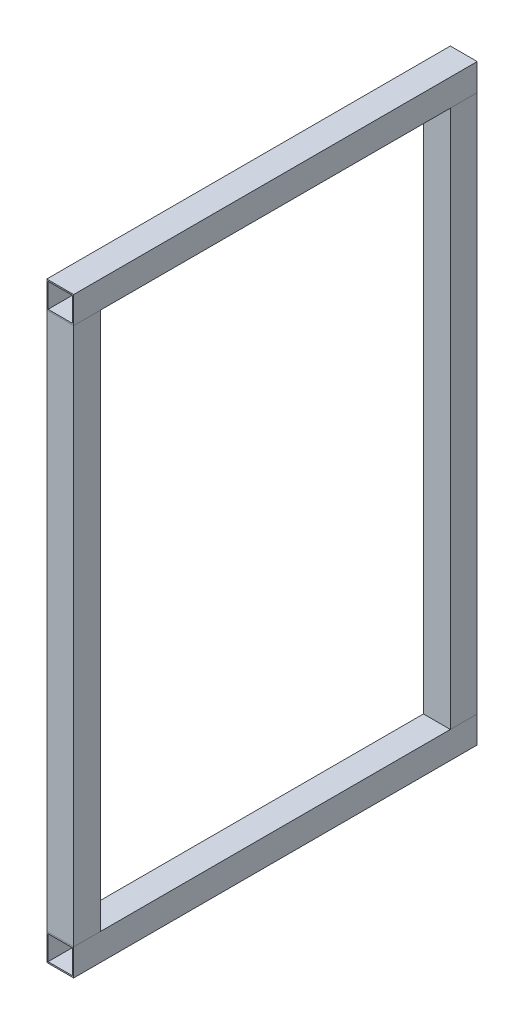
ISO-10303-21;
HEADER;
FILE_DESCRIPTION(('STEP AP214'),'2;1');
FILE_NAME('part.step','',(''),(''),'','','');
FILE_SCHEMA(('AUTOMOTIVE_DESIGN { 1 0 10303 214 1 1 1 1 }'));
ENDSEC;
DATA;
#1=APPLICATION_CONTEXT('core data for automotive mechanical design processes');
#2=APPLICATION_PROTOCOL_DEFINITION('international standard','automotive_design',2000,#1);
#3=PRODUCT_CONTEXT('',#1,'mechanical');
#4=PRODUCT('Part','Part','',(#3));
#5=PRODUCT_RELATED_PRODUCT_CATEGORY('part','',(#4));
#6=PRODUCT_DEFINITION_FORMATION('','',#4);
#7=PRODUCT_DEFINITION_CONTEXT('part definition',#1,'design');
#8=PRODUCT_DEFINITION('design','',#6,#7);
#9=PRODUCT_DEFINITION_SHAPE('','',#8);
#10=(LENGTH_UNIT() NAMED_UNIT(*) SI_UNIT(.MILLI.,.METRE.));
#11=(NAMED_UNIT(*) PLANE_ANGLE_UNIT() SI_UNIT($,.RADIAN.));
#12=(NAMED_UNIT(*) SI_UNIT($,.STERADIAN.) SOLID_ANGLE_UNIT());
#13=UNCERTAINTY_MEASURE_WITH_UNIT(LENGTH_MEASURE(1.E-05),#10,'distance_accuracy_value','');
#14=(GEOMETRIC_REPRESENTATION_CONTEXT(3) GLOBAL_UNCERTAINTY_ASSIGNED_CONTEXT((#13)) GLOBAL_UNIT_ASSIGNED_CONTEXT((#10,
#11,#12)) REPRESENTATION_CONTEXT('',''));
#15=CARTESIAN_POINT('',(0.,0.,0.));
#16=DIRECTION('',(0.,0.,1.));
#17=DIRECTION('',(1.,0.,0.));
#18=AXIS2_PLACEMENT_3D('',#15,#16,#17);
#19=CARTESIAN_POINT('',(133.460829178898,651.380801322445,468.106973865602));
#20=DIRECTION('',(0.,0.,-1.));
#21=DIRECTION('',(-1.,0.,0.));
#22=AXIS2_PLACEMENT_3D('',#19,#20,#21);
#23=PLANE('',#22);
#24=DIRECTION('',(0.,1.,0.));
#25=VECTOR('',#24,1.);
#26=CARTESIAN_POINT('',(143.460829178898,641.380801322445,468.106973865602));
#27=LINE('',#26,#25);
#28=CARTESIAN_POINT('',(143.460829178898,641.380801322445,468.106973865602));
#29=VERTEX_POINT('',#28);
#30=CARTESIAN_POINT('',(143.460829178898,661.380801322445,468.106973865602));
#31=VERTEX_POINT('',#30);
#32=EDGE_CURVE('P0_E117',#29,#31,#27,.T.);
#33=ORIENTED_EDGE('',*,*,#32,.T.);
#34=DIRECTION('',(-1.,0.,0.));
#35=VECTOR('',#34,1.);
#36=CARTESIAN_POINT('',(123.460829178898,661.380801322445,468.106973865602));
#37=LINE('',#36,#35);
#38=CARTESIAN_POINT('',(123.460829178898,661.380801322445,468.106973865602));
#39=VERTEX_POINT('',#38);
#40=EDGE_CURVE('P0_E120',#31,#39,#37,.T.);
#41=ORIENTED_EDGE('',*,*,#40,.T.);
#42=DIRECTION('',(0.,-1.,0.));
#43=VECTOR('',#42,1.);
#44=CARTESIAN_POINT('',(123.460829178898,641.380801322445,468.106973865602));
#45=LINE('',#44,#43);
#46=CARTESIAN_POINT('',(123.460829178898,641.380801322445,468.106973865602));
#47=VERTEX_POINT('',#46);
#48=EDGE_CURVE('P0_E123',#39,#47,#45,.T.);
#49=ORIENTED_EDGE('',*,*,#48,.T.);
#50=DIRECTION('',(1.,0.,0.));
#51=VECTOR('',#50,1.);
#52=CARTESIAN_POINT('',(123.460829178898,641.380801322445,468.106973865602));
#53=LINE('',#52,#51);
#54=EDGE_CURVE('P0_E125',#47,#29,#53,.T.);
#55=ORIENTED_EDGE('',*,*,#54,.T.);
#56=EDGE_LOOP('',(#33,#41,#49,#55));
#57=FACE_BOUND('',#56,.T.);
#58=DIRECTION('',(0.,-1.,0.));
#59=VECTOR('',#58,1.);
#60=CARTESIAN_POINT('',(124.460829178898,642.380801322445,468.106973865602));
#61=LINE('',#60,#59);
#62=CARTESIAN_POINT('',(124.460829178898,660.380801322445,468.106973865602));
#63=VERTEX_POINT('',#62);
#64=CARTESIAN_POINT('',(124.460829178898,642.380801322445,468.106973865602));
#65=VERTEX_POINT('',#64);
#66=EDGE_CURVE('P0_E81',#63,#65,#61,.T.);
#67=ORIENTED_EDGE('',*,*,#66,.F.);
#68=DIRECTION('',(-1.,0.,0.));
#69=VECTOR('',#68,1.);
#70=CARTESIAN_POINT('',(124.460829178898,660.380801322445,468.106973865602));
#71=LINE('',#70,#69);
#72=CARTESIAN_POINT('',(142.460829178898,660.380801322445,468.106973865602));
#73=VERTEX_POINT('',#72);
#74=EDGE_CURVE('P0_E103',#73,#63,#71,.T.);
#75=ORIENTED_EDGE('',*,*,#74,.F.);
#76=DIRECTION('',(0.,1.,0.));
#77=VECTOR('',#76,1.);
#78=CARTESIAN_POINT('',(142.460829178898,642.380801322445,468.106973865602));
#79=LINE('',#78,#77);
#80=CARTESIAN_POINT('',(142.460829178898,642.380801322445,468.106973865602));
#81=VERTEX_POINT('',#80);
#82=EDGE_CURVE('P0_E101',#81,#73,#79,.T.);
#83=ORIENTED_EDGE('',*,*,#82,.F.);
#84=DIRECTION('',(1.,0.,0.));
#85=VECTOR('',#84,1.);
#86=CARTESIAN_POINT('',(124.460829178898,642.380801322445,468.106973865602));
#87=LINE('',#86,#85);
#88=EDGE_CURVE('P0_E89',#65,#81,#87,.T.);
#89=ORIENTED_EDGE('',*,*,#88,.F.);
#90=EDGE_LOOP('',(#67,#75,#83,#89));
#91=FACE_BOUND('',#90,.T.);
#92=ADVANCED_FACE('P0_F16',(#57,#91),#23,.F.);
#93=CARTESIAN_POINT('',(133.460829178898,651.380801322445,168.106973865602));
#94=DIRECTION('',(0.,0.,-1.));
#95=DIRECTION('',(-1.,0.,0.));
#96=AXIS2_PLACEMENT_3D('',#93,#94,#95);
#97=PLANE('',#96);
#98=DIRECTION('',(0.,1.,0.));
#99=VECTOR('',#98,1.);
#100=CARTESIAN_POINT('',(143.460829178898,641.380801322445,168.106973865602));
#101=LINE('',#100,#99);
#102=CARTESIAN_POINT('',(143.460829178898,641.380801322445,168.106973865602));
#103=VERTEX_POINT('',#102);
#104=CARTESIAN_POINT('',(143.460829178898,661.380801322445,168.106973865602));
#105=VERTEX_POINT('',#104);
#106=EDGE_CURVE('P0_E97',#103,#105,#101,.T.);
#107=ORIENTED_EDGE('',*,*,#106,.F.);
#108=DIRECTION('',(1.,0.,0.));
#109=VECTOR('',#108,1.);
#110=CARTESIAN_POINT('',(123.460829178898,641.380801322445,168.106973865602));
#111=LINE('',#110,#109);
#112=CARTESIAN_POINT('',(123.460829178898,641.380801322445,168.106973865602));
#113=VERTEX_POINT('',#112);
#114=EDGE_CURVE('P0_E121',#113,#103,#111,.T.);
#115=ORIENTED_EDGE('',*,*,#114,.F.);
#116=DIRECTION('',(0.,-1.,0.));
#117=VECTOR('',#116,1.);
#118=CARTESIAN_POINT('',(123.460829178898,641.380801322445,168.106973865602));
#119=LINE('',#118,#117);
#120=CARTESIAN_POINT('',(123.460829178898,661.380801322445,168.106973865602));
#121=VERTEX_POINT('',#120);
#122=EDGE_CURVE('P0_E132',#121,#113,#119,.T.);
#123=ORIENTED_EDGE('',*,*,#122,.F.);
#124=DIRECTION('',(-1.,0.,0.));
#125=VECTOR('',#124,1.);
#126=CARTESIAN_POINT('',(123.460829178898,661.380801322445,168.106973865602));
#127=LINE('',#126,#125);
#128=EDGE_CURVE('P0_E130',#105,#121,#127,.T.);
#129=ORIENTED_EDGE('',*,*,#128,.F.);
#130=EDGE_LOOP('',(#107,#115,#123,#129));
#131=FACE_BOUND('',#130,.T.);
#132=DIRECTION('',(-1.,0.,0.));
#133=VECTOR('',#132,1.);
#134=CARTESIAN_POINT('',(124.460829178898,660.380801322445,168.106973865602));
#135=LINE('',#134,#133);
#136=CARTESIAN_POINT('',(142.460829178898,660.380801322445,168.106973865602));
#137=VERTEX_POINT('',#136);
#138=CARTESIAN_POINT('',(124.460829178898,660.380801322445,168.106973865602));
#139=VERTEX_POINT('',#138);
#140=EDGE_CURVE('P0_E90',#137,#139,#135,.T.);
#141=ORIENTED_EDGE('',*,*,#140,.T.);
#142=DIRECTION('',(0.,-1.,0.));
#143=VECTOR('',#142,1.);
#144=CARTESIAN_POINT('',(124.460829178898,642.380801322445,168.106973865602));
#145=LINE('',#144,#143);
#146=CARTESIAN_POINT('',(124.460829178898,642.380801322445,168.106973865602));
#147=VERTEX_POINT('',#146);
#148=EDGE_CURVE('P0_E39',#139,#147,#145,.T.);
#149=ORIENTED_EDGE('',*,*,#148,.T.);
#150=DIRECTION('',(1.,0.,0.));
#151=VECTOR('',#150,1.);
#152=CARTESIAN_POINT('',(124.460829178898,642.380801322445,168.106973865602));
#153=LINE('',#152,#151);
#154=CARTESIAN_POINT('',(142.460829178898,642.380801322445,168.106973865602));
#155=VERTEX_POINT('',#154);
#156=EDGE_CURVE('P0_E96',#147,#155,#153,.T.);
#157=ORIENTED_EDGE('',*,*,#156,.T.);
#158=DIRECTION('',(0.,1.,0.));
#159=VECTOR('',#158,1.);
#160=CARTESIAN_POINT('',(142.460829178898,642.380801322445,168.106973865602));
#161=LINE('',#160,#159);
#162=EDGE_CURVE('P0_E109',#155,#137,#161,.T.);
#163=ORIENTED_EDGE('',*,*,#162,.T.);
#164=EDGE_LOOP('',(#141,#149,#157,#163));
#165=FACE_BOUND('',#164,.T.);
#166=ADVANCED_FACE('P0_F150',(#131,#165),#97,.T.);
#167=CARTESIAN_POINT('',(143.460829178898,641.380801322445,468.106973865602));
#168=DIRECTION('',(-1.,0.,0.));
#169=DIRECTION('',(0.,0.,1.));
#170=AXIS2_PLACEMENT_3D('',#167,#168,#169);
#171=PLANE('',#170);
#172=ORIENTED_EDGE('',*,*,#106,.T.);
#173=DIRECTION('',(0.,0.,-1.));
#174=VECTOR('',#173,1.);
#175=CARTESIAN_POINT('',(143.460829178898,661.380801322445,468.106973865602));
#176=LINE('',#175,#174);
#177=EDGE_CURVE('P0_E10',#31,#105,#176,.T.);
#178=ORIENTED_EDGE('',*,*,#177,.F.);
#179=ORIENTED_EDGE('',*,*,#32,.F.);
#180=DIRECTION('',(0.,0.,-1.));
#181=VECTOR('',#180,1.);
#182=CARTESIAN_POINT('',(143.460829178898,641.380801322445,468.106973865602));
#183=LINE('',#182,#181);
#184=EDGE_CURVE('P0_E127',#29,#103,#183,.T.);
#185=ORIENTED_EDGE('',*,*,#184,.T.);
#186=EDGE_LOOP('',(#172,#178,#179,#185));
#187=FACE_BOUND('',#186,.T.);
#188=ADVANCED_FACE('P0_F18',(#187),#171,.F.);
#189=CARTESIAN_POINT('',(123.460829178898,661.380801322445,468.106973865602));
#190=DIRECTION('',(0.,-1.,0.));
#191=DIRECTION('',(0.,0.,-1.));
#192=AXIS2_PLACEMENT_3D('',#189,#190,#191);
#193=PLANE('',#192);
#194=ORIENTED_EDGE('',*,*,#128,.T.);
#195=DIRECTION('',(0.,0.,-1.));
#196=VECTOR('',#195,1.);
#197=CARTESIAN_POINT('',(123.460829178898,661.380801322445,468.106973865602));
#198=LINE('',#197,#196);
#199=EDGE_CURVE('P0_E24',#39,#121,#198,.T.);
#200=ORIENTED_EDGE('',*,*,#199,.F.);
#201=ORIENTED_EDGE('',*,*,#40,.F.);
#202=ORIENTED_EDGE('',*,*,#177,.T.);
#203=EDGE_LOOP('',(#194,#200,#201,#202));
#204=FACE_BOUND('',#203,.T.);
#205=ADVANCED_FACE('P0_F160',(#204),#193,.F.);
#206=CARTESIAN_POINT('',(123.460829178898,641.380801322445,468.106973865602));
#207=DIRECTION('',(1.,0.,0.));
#208=DIRECTION('',(0.,0.,-1.));
#209=AXIS2_PLACEMENT_3D('',#206,#207,#208);
#210=PLANE('',#209);
#211=ORIENTED_EDGE('',*,*,#122,.T.);
#212=DIRECTION('',(0.,0.,-1.));
#213=VECTOR('',#212,1.);
#214=CARTESIAN_POINT('',(123.460829178898,641.380801322445,468.106973865602));
#215=LINE('',#214,#213);
#216=EDGE_CURVE('P0_E137',#47,#113,#215,.T.);
#217=ORIENTED_EDGE('',*,*,#216,.F.);
#218=ORIENTED_EDGE('',*,*,#48,.F.);
#219=ORIENTED_EDGE('',*,*,#199,.T.);
#220=EDGE_LOOP('',(#211,#217,#218,#219));
#221=FACE_BOUND('',#220,.T.);
#222=ADVANCED_FACE('P0_F144',(#221),#210,.F.);
#223=CARTESIAN_POINT('',(123.460829178898,641.380801322445,468.106973865602));
#224=DIRECTION('',(0.,1.,0.));
#225=DIRECTION('',(0.,0.,1.));
#226=AXIS2_PLACEMENT_3D('',#223,#224,#225);
#227=PLANE('',#226);
#228=ORIENTED_EDGE('',*,*,#114,.T.);
#229=ORIENTED_EDGE('',*,*,#184,.F.);
#230=ORIENTED_EDGE('',*,*,#54,.F.);
#231=ORIENTED_EDGE('',*,*,#216,.T.);
#232=EDGE_LOOP('',(#228,#229,#230,#231));
#233=FACE_BOUND('',#232,.T.);
#234=ADVANCED_FACE('P0_F154',(#233),#227,.F.);
#235=CARTESIAN_POINT('',(124.460829178898,642.380801322445,468.106973865602));
#236=DIRECTION('',(1.,0.,0.));
#237=DIRECTION('',(0.,0.,-1.));
#238=AXIS2_PLACEMENT_3D('',#235,#236,#237);
#239=PLANE('',#238);
#240=ORIENTED_EDGE('',*,*,#148,.F.);
#241=DIRECTION('',(0.,0.,-1.));
#242=VECTOR('',#241,1.);
#243=CARTESIAN_POINT('',(124.460829178898,660.380801322445,468.106973865602));
#244=LINE('',#243,#242);
#245=EDGE_CURVE('P0_E85',#63,#139,#244,.T.);
#246=ORIENTED_EDGE('',*,*,#245,.F.);
#247=ORIENTED_EDGE('',*,*,#66,.T.);
#248=DIRECTION('',(0.,0.,-1.));
#249=VECTOR('',#248,1.);
#250=CARTESIAN_POINT('',(124.460829178898,642.380801322445,468.106973865602));
#251=LINE('',#250,#249);
#252=EDGE_CURVE('P0_E84',#65,#147,#251,.T.);
#253=ORIENTED_EDGE('',*,*,#252,.T.);
#254=EDGE_LOOP('',(#240,#246,#247,#253));
#255=FACE_BOUND('',#254,.T.);
#256=ADVANCED_FACE('P0_F83',(#255),#239,.T.);
#257=CARTESIAN_POINT('',(124.460829178898,642.380801322445,468.106973865602));
#258=DIRECTION('',(0.,1.,0.));
#259=DIRECTION('',(0.,0.,1.));
#260=AXIS2_PLACEMENT_3D('',#257,#258,#259);
#261=PLANE('',#260);
#262=ORIENTED_EDGE('',*,*,#156,.F.);
#263=ORIENTED_EDGE('',*,*,#252,.F.);
#264=ORIENTED_EDGE('',*,*,#88,.T.);
#265=DIRECTION('',(0.,0.,-1.));
#266=VECTOR('',#265,1.);
#267=CARTESIAN_POINT('',(142.460829178898,642.380801322445,468.106973865602));
#268=LINE('',#267,#266);
#269=EDGE_CURVE('P0_E98',#81,#155,#268,.T.);
#270=ORIENTED_EDGE('',*,*,#269,.T.);
#271=EDGE_LOOP('',(#262,#263,#264,#270));
#272=FACE_BOUND('',#271,.T.);
#273=ADVANCED_FACE('P0_F93',(#272),#261,.T.);
#274=CARTESIAN_POINT('',(142.460829178898,642.380801322445,468.106973865602));
#275=DIRECTION('',(-1.,0.,0.));
#276=DIRECTION('',(0.,0.,1.));
#277=AXIS2_PLACEMENT_3D('',#274,#275,#276);
#278=PLANE('',#277);
#279=ORIENTED_EDGE('',*,*,#162,.F.);
#280=ORIENTED_EDGE('',*,*,#269,.F.);
#281=ORIENTED_EDGE('',*,*,#82,.T.);
#282=DIRECTION('',(0.,0.,-1.));
#283=VECTOR('',#282,1.);
#284=CARTESIAN_POINT('',(142.460829178898,660.380801322445,468.106973865602));
#285=LINE('',#284,#283);
#286=EDGE_CURVE('P0_E31',#73,#137,#285,.T.);
#287=ORIENTED_EDGE('',*,*,#286,.T.);
#288=EDGE_LOOP('',(#279,#280,#281,#287));
#289=FACE_BOUND('',#288,.T.);
#290=ADVANCED_FACE('P0_F184',(#289),#278,.T.);
#291=CARTESIAN_POINT('',(124.460829178898,660.380801322445,468.106973865602));
#292=DIRECTION('',(0.,-1.,0.));
#293=DIRECTION('',(0.,0.,-1.));
#294=AXIS2_PLACEMENT_3D('',#291,#292,#293);
#295=PLANE('',#294);
#296=ORIENTED_EDGE('',*,*,#140,.F.);
#297=ORIENTED_EDGE('',*,*,#286,.F.);
#298=ORIENTED_EDGE('',*,*,#74,.T.);
#299=ORIENTED_EDGE('',*,*,#245,.T.);
#300=EDGE_LOOP('',(#296,#297,#298,#299));
#301=FACE_BOUND('',#300,.T.);
#302=ADVANCED_FACE('P0_F188',(#301),#295,.T.);
#303=CLOSED_SHELL('',(#92,#166,#188,#205,#222,#234,#256,#273,#290,#302));
#304=MANIFOLD_SOLID_BREP('P0_B1',#303);
#305=CARTESIAN_POINT('',(133.460829178898,641.380801322445,178.106973865602));
#306=DIRECTION('',(0.,-1.,0.));
#307=DIRECTION('',(-1.,0.,0.));
#308=AXIS2_PLACEMENT_3D('',#305,#306,#307);
#309=PLANE('',#308);
#310=DIRECTION('',(0.,0.,-1.));
#311=VECTOR('',#310,1.);
#312=CARTESIAN_POINT('',(143.460829178898,641.380801322445,188.106973865602));
#313=LINE('',#312,#311);
#314=CARTESIAN_POINT('',(143.460829178898,641.380801322445,188.106973865602));
#315=VERTEX_POINT('',#314);
#316=CARTESIAN_POINT('',(143.460829178898,641.380801322445,168.106973865602));
#317=VERTEX_POINT('',#316);
#318=EDGE_CURVE('P1_E118',#315,#317,#313,.T.);
#319=ORIENTED_EDGE('',*,*,#318,.T.);
#320=DIRECTION('',(-1.,0.,0.));
#321=VECTOR('',#320,1.);
#322=CARTESIAN_POINT('',(123.460829178898,641.380801322445,168.106973865602));
#323=LINE('',#322,#321);
#324=CARTESIAN_POINT('',(123.460829178898,641.380801322445,168.106973865602));
#325=VERTEX_POINT('',#324);
#326=EDGE_CURVE('P1_E121',#317,#325,#323,.T.);
#327=ORIENTED_EDGE('',*,*,#326,.T.);
#328=DIRECTION('',(0.,0.,1.));
#329=VECTOR('',#328,1.);
#330=CARTESIAN_POINT('',(123.460829178898,641.380801322445,188.106973865602));
#331=LINE('',#330,#329);
#332=CARTESIAN_POINT('',(123.460829178898,641.380801322445,188.106973865602));
#333=VERTEX_POINT('',#332);
#334=EDGE_CURVE('P1_E124',#325,#333,#331,.T.);
#335=ORIENTED_EDGE('',*,*,#334,.T.);
#336=DIRECTION('',(1.,0.,0.));
#337=VECTOR('',#336,1.);
#338=CARTESIAN_POINT('',(123.460829178898,641.380801322445,188.106973865602));
#339=LINE('',#338,#337);
#340=EDGE_CURVE('P1_E126',#333,#315,#339,.T.);
#341=ORIENTED_EDGE('',*,*,#340,.T.);
#342=EDGE_LOOP('',(#319,#327,#335,#341));
#343=FACE_BOUND('',#342,.T.);
#344=DIRECTION('',(0.,0.,1.));
#345=VECTOR('',#344,1.);
#346=CARTESIAN_POINT('',(124.460829178898,641.380801322445,187.106973865602));
#347=LINE('',#346,#345);
#348=CARTESIAN_POINT('',(124.460829178898,641.380801322445,169.106973865602));
#349=VERTEX_POINT('',#348);
#350=CARTESIAN_POINT('',(124.460829178898,641.380801322445,187.106973865602));
#351=VERTEX_POINT('',#350);
#352=EDGE_CURVE('P1_E82',#349,#351,#347,.T.);
#353=ORIENTED_EDGE('',*,*,#352,.F.);
#354=DIRECTION('',(-1.,0.,0.));
#355=VECTOR('',#354,1.);
#356=CARTESIAN_POINT('',(124.460829178898,641.380801322445,169.106973865602));
#357=LINE('',#356,#355);
#358=CARTESIAN_POINT('',(142.460829178898,641.380801322445,169.106973865602));
#359=VERTEX_POINT('',#358);
#360=EDGE_CURVE('P1_E104',#359,#349,#357,.T.);
#361=ORIENTED_EDGE('',*,*,#360,.F.);
#362=DIRECTION('',(0.,0.,-1.));
#363=VECTOR('',#362,1.);
#364=CARTESIAN_POINT('',(142.460829178898,641.380801322445,187.106973865602));
#365=LINE('',#364,#363);
#366=CARTESIAN_POINT('',(142.460829178898,641.380801322445,187.106973865602));
#367=VERTEX_POINT('',#366);
#368=EDGE_CURVE('P1_E102',#367,#359,#365,.T.);
#369=ORIENTED_EDGE('',*,*,#368,.F.);
#370=DIRECTION('',(1.,0.,0.));
#371=VECTOR('',#370,1.);
#372=CARTESIAN_POINT('',(124.460829178898,641.380801322445,187.106973865602));
#373=LINE('',#372,#371);
#374=EDGE_CURVE('P1_E90',#351,#367,#373,.T.);
#375=ORIENTED_EDGE('',*,*,#374,.F.);
#376=EDGE_LOOP('',(#353,#361,#369,#375));
#377=FACE_BOUND('',#376,.T.);
#378=ADVANCED_FACE('P1_F17',(#343,#377),#309,.F.);
#379=CARTESIAN_POINT('',(133.460829178898,241.380801322445,178.106973865602));
#380=DIRECTION('',(0.,-1.,0.));
#381=DIRECTION('',(-1.,0.,0.));
#382=AXIS2_PLACEMENT_3D('',#379,#380,#381);
#383=PLANE('',#382);
#384=DIRECTION('',(0.,0.,-1.));
#385=VECTOR('',#384,1.);
#386=CARTESIAN_POINT('',(143.460829178898,241.380801322445,188.106973865602));
#387=LINE('',#386,#385);
#388=CARTESIAN_POINT('',(143.460829178898,241.380801322445,188.106973865602));
#389=VERTEX_POINT('',#388);
#390=CARTESIAN_POINT('',(143.460829178898,241.380801322445,168.106973865602));
#391=VERTEX_POINT('',#390);
#392=EDGE_CURVE('P1_E98',#389,#391,#387,.T.);
#393=ORIENTED_EDGE('',*,*,#392,.F.);
#394=DIRECTION('',(1.,0.,0.));
#395=VECTOR('',#394,1.);
#396=CARTESIAN_POINT('',(123.460829178898,241.380801322445,188.106973865602));
#397=LINE('',#396,#395);
#398=CARTESIAN_POINT('',(123.460829178898,241.380801322445,188.106973865602));
#399=VERTEX_POINT('',#398);
#400=EDGE_CURVE('P1_E122',#399,#389,#397,.T.);
#401=ORIENTED_EDGE('',*,*,#400,.F.);
#402=DIRECTION('',(0.,0.,1.));
#403=VECTOR('',#402,1.);
#404=CARTESIAN_POINT('',(123.460829178898,241.380801322445,188.106973865602));
#405=LINE('',#404,#403);
#406=CARTESIAN_POINT('',(123.460829178898,241.380801322445,168.106973865602));
#407=VERTEX_POINT('',#406);
#408=EDGE_CURVE('P1_E133',#407,#399,#405,.T.);
#409=ORIENTED_EDGE('',*,*,#408,.F.);
#410=DIRECTION('',(-1.,0.,0.));
#411=VECTOR('',#410,1.);
#412=CARTESIAN_POINT('',(123.460829178898,241.380801322445,168.106973865602));
#413=LINE('',#412,#411);
#414=EDGE_CURVE('P1_E131',#391,#407,#413,.T.);
#415=ORIENTED_EDGE('',*,*,#414,.F.);
#416=EDGE_LOOP('',(#393,#401,#409,#415));
#417=FACE_BOUND('',#416,.T.);
#418=DIRECTION('',(-1.,0.,0.));
#419=VECTOR('',#418,1.);
#420=CARTESIAN_POINT('',(124.460829178898,241.380801322445,169.106973865602));
#421=LINE('',#420,#419);
#422=CARTESIAN_POINT('',(142.460829178898,241.380801322445,169.106973865602));
#423=VERTEX_POINT('',#422);
#424=CARTESIAN_POINT('',(124.460829178898,241.380801322445,169.106973865602));
#425=VERTEX_POINT('',#424);
#426=EDGE_CURVE('P1_E91',#423,#425,#421,.T.);
#427=ORIENTED_EDGE('',*,*,#426,.T.);
#428=DIRECTION('',(0.,0.,1.));
#429=VECTOR('',#428,1.);
#430=CARTESIAN_POINT('',(124.460829178898,241.380801322445,187.106973865602));
#431=LINE('',#430,#429);
#432=CARTESIAN_POINT('',(124.460829178898,241.380801322445,187.106973865602));
#433=VERTEX_POINT('',#432);
#434=EDGE_CURVE('P1_E40',#425,#433,#431,.T.);
#435=ORIENTED_EDGE('',*,*,#434,.T.);
#436=DIRECTION('',(1.,0.,0.));
#437=VECTOR('',#436,1.);
#438=CARTESIAN_POINT('',(124.460829178898,241.380801322445,187.106973865602));
#439=LINE('',#438,#437);
#440=CARTESIAN_POINT('',(142.460829178898,241.380801322445,187.106973865602));
#441=VERTEX_POINT('',#440);
#442=EDGE_CURVE('P1_E97',#433,#441,#439,.T.);
#443=ORIENTED_EDGE('',*,*,#442,.T.);
#444=DIRECTION('',(0.,0.,-1.));
#445=VECTOR('',#444,1.);
#446=CARTESIAN_POINT('',(142.460829178898,241.380801322445,187.106973865602));
#447=LINE('',#446,#445);
#448=EDGE_CURVE('P1_E110',#441,#423,#447,.T.);
#449=ORIENTED_EDGE('',*,*,#448,.T.);
#450=EDGE_LOOP('',(#427,#435,#443,#449));
#451=FACE_BOUND('',#450,.T.);
#452=ADVANCED_FACE('P1_F151',(#417,#451),#383,.T.);
#453=CARTESIAN_POINT('',(143.460829178898,641.380801322445,188.106973865602));
#454=DIRECTION('',(-1.,0.,0.));
#455=DIRECTION('',(0.,1.,0.));
#456=AXIS2_PLACEMENT_3D('',#453,#454,#455);
#457=PLANE('',#456);
#458=ORIENTED_EDGE('',*,*,#392,.T.);
#459=DIRECTION('',(0.,-1.,0.));
#460=VECTOR('',#459,1.);
#461=CARTESIAN_POINT('',(143.460829178898,641.380801322445,168.106973865602));
#462=LINE('',#461,#460);
#463=EDGE_CURVE('P1_E11',#317,#391,#462,.T.);
#464=ORIENTED_EDGE('',*,*,#463,.F.);
#465=ORIENTED_EDGE('',*,*,#318,.F.);
#466=DIRECTION('',(0.,-1.,0.));
#467=VECTOR('',#466,1.);
#468=CARTESIAN_POINT('',(143.460829178898,641.380801322445,188.106973865602));
#469=LINE('',#468,#467);
#470=EDGE_CURVE('P1_E128',#315,#389,#469,.T.);
#471=ORIENTED_EDGE('',*,*,#470,.T.);
#472=EDGE_LOOP('',(#458,#464,#465,#471));
#473=FACE_BOUND('',#472,.T.);
#474=ADVANCED_FACE('P1_F19',(#473),#457,.F.);
#475=CARTESIAN_POINT('',(123.460829178898,641.380801322445,168.106973865602));
#476=DIRECTION('',(0.,0.,1.));
#477=DIRECTION('',(0.,-1.,0.));
#478=AXIS2_PLACEMENT_3D('',#475,#476,#477);
#479=PLANE('',#478);
#480=ORIENTED_EDGE('',*,*,#414,.T.);
#481=DIRECTION('',(0.,-1.,0.));
#482=VECTOR('',#481,1.);
#483=CARTESIAN_POINT('',(123.460829178898,641.380801322445,168.106973865602));
#484=LINE('',#483,#482);
#485=EDGE_CURVE('P1_E25',#325,#407,#484,.T.);
#486=ORIENTED_EDGE('',*,*,#485,.F.);
#487=ORIENTED_EDGE('',*,*,#326,.F.);
#488=ORIENTED_EDGE('',*,*,#463,.T.);
#489=EDGE_LOOP('',(#480,#486,#487,#488));
#490=FACE_BOUND('',#489,.T.);
#491=ADVANCED_FACE('P1_F161',(#490),#479,.F.);
#492=CARTESIAN_POINT('',(123.460829178898,641.380801322445,188.106973865602));
#493=DIRECTION('',(1.,0.,0.));
#494=DIRECTION('',(0.,-1.,0.));
#495=AXIS2_PLACEMENT_3D('',#492,#493,#494);
#496=PLANE('',#495);
#497=ORIENTED_EDGE('',*,*,#408,.T.);
#498=DIRECTION('',(0.,-1.,0.));
#499=VECTOR('',#498,1.);
#500=CARTESIAN_POINT('',(123.460829178898,641.380801322445,188.106973865602));
#501=LINE('',#500,#499);
#502=EDGE_CURVE('P1_E138',#333,#399,#501,.T.);
#503=ORIENTED_EDGE('',*,*,#502,.F.);
#504=ORIENTED_EDGE('',*,*,#334,.F.);
#505=ORIENTED_EDGE('',*,*,#485,.T.);
#506=EDGE_LOOP('',(#497,#503,#504,#505));
#507=FACE_BOUND('',#506,.T.);
#508=ADVANCED_FACE('P1_F145',(#507),#496,.F.);
#509=CARTESIAN_POINT('',(123.460829178898,641.380801322445,188.106973865602));
#510=DIRECTION('',(0.,0.,-1.));
#511=DIRECTION('',(0.,1.,0.));
#512=AXIS2_PLACEMENT_3D('',#509,#510,#511);
#513=PLANE('',#512);
#514=ORIENTED_EDGE('',*,*,#400,.T.);
#515=ORIENTED_EDGE('',*,*,#470,.F.);
#516=ORIENTED_EDGE('',*,*,#340,.F.);
#517=ORIENTED_EDGE('',*,*,#502,.T.);
#518=EDGE_LOOP('',(#514,#515,#516,#517));
#519=FACE_BOUND('',#518,.T.);
#520=ADVANCED_FACE('P1_F155',(#519),#513,.F.);
#521=CARTESIAN_POINT('',(124.460829178898,641.380801322445,187.106973865602));
#522=DIRECTION('',(1.,0.,0.));
#523=DIRECTION('',(0.,-1.,0.));
#524=AXIS2_PLACEMENT_3D('',#521,#522,#523);
#525=PLANE('',#524);
#526=ORIENTED_EDGE('',*,*,#434,.F.);
#527=DIRECTION('',(0.,-1.,0.));
#528=VECTOR('',#527,1.);
#529=CARTESIAN_POINT('',(124.460829178898,641.380801322445,169.106973865602));
#530=LINE('',#529,#528);
#531=EDGE_CURVE('P1_E86',#349,#425,#530,.T.);
#532=ORIENTED_EDGE('',*,*,#531,.F.);
#533=ORIENTED_EDGE('',*,*,#352,.T.);
#534=DIRECTION('',(0.,-1.,0.));
#535=VECTOR('',#534,1.);
#536=CARTESIAN_POINT('',(124.460829178898,641.380801322445,187.106973865602));
#537=LINE('',#536,#535);
#538=EDGE_CURVE('P1_E85',#351,#433,#537,.T.);
#539=ORIENTED_EDGE('',*,*,#538,.T.);
#540=EDGE_LOOP('',(#526,#532,#533,#539));
#541=FACE_BOUND('',#540,.T.);
#542=ADVANCED_FACE('P1_F84',(#541),#525,.T.);
#543=CARTESIAN_POINT('',(124.460829178898,641.380801322445,187.106973865602));
#544=DIRECTION('',(0.,0.,-1.));
#545=DIRECTION('',(0.,1.,0.));
#546=AXIS2_PLACEMENT_3D('',#543,#544,#545);
#547=PLANE('',#546);
#548=ORIENTED_EDGE('',*,*,#442,.F.);
#549=ORIENTED_EDGE('',*,*,#538,.F.);
#550=ORIENTED_EDGE('',*,*,#374,.T.);
#551=DIRECTION('',(0.,-1.,0.));
#552=VECTOR('',#551,1.);
#553=CARTESIAN_POINT('',(142.460829178898,641.380801322445,187.106973865602));
#554=LINE('',#553,#552);
#555=EDGE_CURVE('P1_E99',#367,#441,#554,.T.);
#556=ORIENTED_EDGE('',*,*,#555,.T.);
#557=EDGE_LOOP('',(#548,#549,#550,#556));
#558=FACE_BOUND('',#557,.T.);
#559=ADVANCED_FACE('P1_F94',(#558),#547,.T.);
#560=CARTESIAN_POINT('',(142.460829178898,641.380801322445,187.106973865602));
#561=DIRECTION('',(-1.,0.,0.));
#562=DIRECTION('',(0.,1.,0.));
#563=AXIS2_PLACEMENT_3D('',#560,#561,#562);
#564=PLANE('',#563);
#565=ORIENTED_EDGE('',*,*,#448,.F.);
#566=ORIENTED_EDGE('',*,*,#555,.F.);
#567=ORIENTED_EDGE('',*,*,#368,.T.);
#568=DIRECTION('',(0.,-1.,0.));
#569=VECTOR('',#568,1.);
#570=CARTESIAN_POINT('',(142.460829178898,641.380801322445,169.106973865602));
#571=LINE('',#570,#569);
#572=EDGE_CURVE('P1_E32',#359,#423,#571,.T.);
#573=ORIENTED_EDGE('',*,*,#572,.T.);
#574=EDGE_LOOP('',(#565,#566,#567,#573));
#575=FACE_BOUND('',#574,.T.);
#576=ADVANCED_FACE('P1_F185',(#575),#564,.T.);
#577=CARTESIAN_POINT('',(124.460829178898,641.380801322445,169.106973865602));
#578=DIRECTION('',(0.,0.,1.));
#579=DIRECTION('',(0.,-1.,0.));
#580=AXIS2_PLACEMENT_3D('',#577,#578,#579);
#581=PLANE('',#580);
#582=ORIENTED_EDGE('',*,*,#426,.F.);
#583=ORIENTED_EDGE('',*,*,#572,.F.);
#584=ORIENTED_EDGE('',*,*,#360,.T.);
#585=ORIENTED_EDGE('',*,*,#531,.T.);
#586=EDGE_LOOP('',(#582,#583,#584,#585));
#587=FACE_BOUND('',#586,.T.);
#588=ADVANCED_FACE('P1_F189',(#587),#581,.T.);
#589=CLOSED_SHELL('',(#378,#452,#474,#491,#508,#520,#542,#559,#576,#588));
#590=MANIFOLD_SOLID_BREP('P1_B1',#589);
#591=CARTESIAN_POINT('',(133.460829178898,231.380801322445,468.106973865602));
#592=DIRECTION('',(0.,0.,-1.));
#593=DIRECTION('',(-1.,0.,0.));
#594=AXIS2_PLACEMENT_3D('',#591,#592,#593);
#595=PLANE('',#594);
#596=DIRECTION('',(0.,1.,0.));
#597=VECTOR('',#596,1.);
#598=CARTESIAN_POINT('',(143.460829178898,221.380801322445,468.106973865602));
#599=LINE('',#598,#597);
#600=CARTESIAN_POINT('',(143.460829178898,221.380801322445,468.106973865602));
#601=VERTEX_POINT('',#600);
#602=CARTESIAN_POINT('',(143.460829178898,241.380801322445,468.106973865602));
#603=VERTEX_POINT('',#602);
#604=EDGE_CURVE('P2_E118',#601,#603,#599,.T.);
#605=ORIENTED_EDGE('',*,*,#604,.T.);
#606=DIRECTION('',(-1.,0.,0.));
#607=VECTOR('',#606,1.);
#608=CARTESIAN_POINT('',(123.460829178898,241.380801322445,468.106973865602));
#609=LINE('',#608,#607);
#610=CARTESIAN_POINT('',(123.460829178898,241.380801322445,468.106973865602));
#611=VERTEX_POINT('',#610);
#612=EDGE_CURVE('P2_E121',#603,#611,#609,.T.);
#613=ORIENTED_EDGE('',*,*,#612,.T.);
#614=DIRECTION('',(0.,-1.,0.));
#615=VECTOR('',#614,1.);
#616=CARTESIAN_POINT('',(123.460829178898,221.380801322445,468.106973865602));
#617=LINE('',#616,#615);
#618=CARTESIAN_POINT('',(123.460829178898,221.380801322445,468.106973865602));
#619=VERTEX_POINT('',#618);
#620=EDGE_CURVE('P2_E124',#611,#619,#617,.T.);
#621=ORIENTED_EDGE('',*,*,#620,.T.);
#622=DIRECTION('',(1.,0.,0.));
#623=VECTOR('',#622,1.);
#624=CARTESIAN_POINT('',(123.460829178898,221.380801322445,468.106973865602));
#625=LINE('',#624,#623);
#626=EDGE_CURVE('P2_E126',#619,#601,#625,.T.);
#627=ORIENTED_EDGE('',*,*,#626,.T.);
#628=EDGE_LOOP('',(#605,#613,#621,#627));
#629=FACE_BOUND('',#628,.T.);
#630=DIRECTION('',(0.,-1.,0.));
#631=VECTOR('',#630,1.);
#632=CARTESIAN_POINT('',(124.460829178898,222.380801322445,468.106973865602));
#633=LINE('',#632,#631);
#634=CARTESIAN_POINT('',(124.460829178898,240.380801322445,468.106973865602));
#635=VERTEX_POINT('',#634);
#636=CARTESIAN_POINT('',(124.460829178898,222.380801322445,468.106973865602));
#637=VERTEX_POINT('',#636);
#638=EDGE_CURVE('P2_E82',#635,#637,#633,.T.);
#639=ORIENTED_EDGE('',*,*,#638,.F.);
#640=DIRECTION('',(-1.,0.,0.));
#641=VECTOR('',#640,1.);
#642=CARTESIAN_POINT('',(124.460829178898,240.380801322445,468.106973865602));
#643=LINE('',#642,#641);
#644=CARTESIAN_POINT('',(142.460829178898,240.380801322445,468.106973865602));
#645=VERTEX_POINT('',#644);
#646=EDGE_CURVE('P2_E104',#645,#635,#643,.T.);
#647=ORIENTED_EDGE('',*,*,#646,.F.);
#648=DIRECTION('',(0.,1.,0.));
#649=VECTOR('',#648,1.);
#650=CARTESIAN_POINT('',(142.460829178898,222.380801322445,468.106973865602));
#651=LINE('',#650,#649);
#652=CARTESIAN_POINT('',(142.460829178898,222.380801322445,468.106973865602));
#653=VERTEX_POINT('',#652);
#654=EDGE_CURVE('P2_E102',#653,#645,#651,.T.);
#655=ORIENTED_EDGE('',*,*,#654,.F.);
#656=DIRECTION('',(1.,0.,0.));
#657=VECTOR('',#656,1.);
#658=CARTESIAN_POINT('',(124.460829178898,222.380801322445,468.106973865602));
#659=LINE('',#658,#657);
#660=EDGE_CURVE('P2_E90',#637,#653,#659,.T.);
#661=ORIENTED_EDGE('',*,*,#660,.F.);
#662=EDGE_LOOP('',(#639,#647,#655,#661));
#663=FACE_BOUND('',#662,.T.);
#664=ADVANCED_FACE('P2_F17',(#629,#663),#595,.F.);
#665=CARTESIAN_POINT('',(133.460829178898,231.380801322445,168.106973865602));
#666=DIRECTION('',(0.,0.,-1.));
#667=DIRECTION('',(-1.,0.,0.));
#668=AXIS2_PLACEMENT_3D('',#665,#666,#667);
#669=PLANE('',#668);
#670=DIRECTION('',(0.,1.,0.));
#671=VECTOR('',#670,1.);
#672=CARTESIAN_POINT('',(143.460829178898,221.380801322445,168.106973865602));
#673=LINE('',#672,#671);
#674=CARTESIAN_POINT('',(143.460829178898,221.380801322445,168.106973865602));
#675=VERTEX_POINT('',#674);
#676=CARTESIAN_POINT('',(143.460829178898,241.380801322445,168.106973865602));
#677=VERTEX_POINT('',#676);
#678=EDGE_CURVE('P2_E98',#675,#677,#673,.T.);
#679=ORIENTED_EDGE('',*,*,#678,.F.);
#680=DIRECTION('',(1.,0.,0.));
#681=VECTOR('',#680,1.);
#682=CARTESIAN_POINT('',(123.460829178898,221.380801322445,168.106973865602));
#683=LINE('',#682,#681);
#684=CARTESIAN_POINT('',(123.460829178898,221.380801322445,168.106973865602));
#685=VERTEX_POINT('',#684);
#686=EDGE_CURVE('P2_E122',#685,#675,#683,.T.);
#687=ORIENTED_EDGE('',*,*,#686,.F.);
#688=DIRECTION('',(0.,-1.,0.));
#689=VECTOR('',#688,1.);
#690=CARTESIAN_POINT('',(123.460829178898,221.380801322445,168.106973865602));
#691=LINE('',#690,#689);
#692=CARTESIAN_POINT('',(123.460829178898,241.380801322445,168.106973865602));
#693=VERTEX_POINT('',#692);
#694=EDGE_CURVE('P2_E133',#693,#685,#691,.T.);
#695=ORIENTED_EDGE('',*,*,#694,.F.);
#696=DIRECTION('',(-1.,0.,0.));
#697=VECTOR('',#696,1.);
#698=CARTESIAN_POINT('',(123.460829178898,241.380801322445,168.106973865602));
#699=LINE('',#698,#697);
#700=EDGE_CURVE('P2_E131',#677,#693,#699,.T.);
#701=ORIENTED_EDGE('',*,*,#700,.F.);
#702=EDGE_LOOP('',(#679,#687,#695,#701));
#703=FACE_BOUND('',#702,.T.);
#704=DIRECTION('',(-1.,0.,0.));
#705=VECTOR('',#704,1.);
#706=CARTESIAN_POINT('',(124.460829178898,240.380801322445,168.106973865602));
#707=LINE('',#706,#705);
#708=CARTESIAN_POINT('',(142.460829178898,240.380801322445,168.106973865602));
#709=VERTEX_POINT('',#708);
#710=CARTESIAN_POINT('',(124.460829178898,240.380801322445,168.106973865602));
#711=VERTEX_POINT('',#710);
#712=EDGE_CURVE('P2_E91',#709,#711,#707,.T.);
#713=ORIENTED_EDGE('',*,*,#712,.T.);
#714=DIRECTION('',(0.,-1.,0.));
#715=VECTOR('',#714,1.);
#716=CARTESIAN_POINT('',(124.460829178898,222.380801322445,168.106973865602));
#717=LINE('',#716,#715);
#718=CARTESIAN_POINT('',(124.460829178898,222.380801322445,168.106973865602));
#719=VERTEX_POINT('',#718);
#720=EDGE_CURVE('P2_E40',#711,#719,#717,.T.);
#721=ORIENTED_EDGE('',*,*,#720,.T.);
#722=DIRECTION('',(1.,0.,0.));
#723=VECTOR('',#722,1.);
#724=CARTESIAN_POINT('',(124.460829178898,222.380801322445,168.106973865602));
#725=LINE('',#724,#723);
#726=CARTESIAN_POINT('',(142.460829178898,222.380801322445,168.106973865602));
#727=VERTEX_POINT('',#726);
#728=EDGE_CURVE('P2_E97',#719,#727,#725,.T.);
#729=ORIENTED_EDGE('',*,*,#728,.T.);
#730=DIRECTION('',(0.,1.,0.));
#731=VECTOR('',#730,1.);
#732=CARTESIAN_POINT('',(142.460829178898,222.380801322445,168.106973865602));
#733=LINE('',#732,#731);
#734=EDGE_CURVE('P2_E110',#727,#709,#733,.T.);
#735=ORIENTED_EDGE('',*,*,#734,.T.);
#736=EDGE_LOOP('',(#713,#721,#729,#735));
#737=FACE_BOUND('',#736,.T.);
#738=ADVANCED_FACE('P2_F151',(#703,#737),#669,.T.);
#739=CARTESIAN_POINT('',(143.460829178898,221.380801322445,468.106973865602));
#740=DIRECTION('',(-1.,0.,0.));
#741=DIRECTION('',(0.,0.,1.));
#742=AXIS2_PLACEMENT_3D('',#739,#740,#741);
#743=PLANE('',#742);
#744=ORIENTED_EDGE('',*,*,#678,.T.);
#745=DIRECTION('',(0.,0.,-1.));
#746=VECTOR('',#745,1.);
#747=CARTESIAN_POINT('',(143.460829178898,241.380801322445,468.106973865602));
#748=LINE('',#747,#746);
#749=EDGE_CURVE('P2_E11',#603,#677,#748,.T.);
#750=ORIENTED_EDGE('',*,*,#749,.F.);
#751=ORIENTED_EDGE('',*,*,#604,.F.);
#752=DIRECTION('',(0.,0.,-1.));
#753=VECTOR('',#752,1.);
#754=CARTESIAN_POINT('',(143.460829178898,221.380801322445,468.106973865602));
#755=LINE('',#754,#753);
#756=EDGE_CURVE('P2_E128',#601,#675,#755,.T.);
#757=ORIENTED_EDGE('',*,*,#756,.T.);
#758=EDGE_LOOP('',(#744,#750,#751,#757));
#759=FACE_BOUND('',#758,.T.);
#760=ADVANCED_FACE('P2_F19',(#759),#743,.F.);
#761=CARTESIAN_POINT('',(123.460829178898,241.380801322445,468.106973865602));
#762=DIRECTION('',(0.,-1.,0.));
#763=DIRECTION('',(0.,0.,-1.));
#764=AXIS2_PLACEMENT_3D('',#761,#762,#763);
#765=PLANE('',#764);
#766=ORIENTED_EDGE('',*,*,#700,.T.);
#767=DIRECTION('',(0.,0.,-1.));
#768=VECTOR('',#767,1.);
#769=CARTESIAN_POINT('',(123.460829178898,241.380801322445,468.106973865602));
#770=LINE('',#769,#768);
#771=EDGE_CURVE('P2_E25',#611,#693,#770,.T.);
#772=ORIENTED_EDGE('',*,*,#771,.F.);
#773=ORIENTED_EDGE('',*,*,#612,.F.);
#774=ORIENTED_EDGE('',*,*,#749,.T.);
#775=EDGE_LOOP('',(#766,#772,#773,#774));
#776=FACE_BOUND('',#775,.T.);
#777=ADVANCED_FACE('P2_F161',(#776),#765,.F.);
#778=CARTESIAN_POINT('',(123.460829178898,221.380801322445,468.106973865602));
#779=DIRECTION('',(1.,0.,0.));
#780=DIRECTION('',(0.,0.,-1.));
#781=AXIS2_PLACEMENT_3D('',#778,#779,#780);
#782=PLANE('',#781);
#783=ORIENTED_EDGE('',*,*,#694,.T.);
#784=DIRECTION('',(0.,0.,-1.));
#785=VECTOR('',#784,1.);
#786=CARTESIAN_POINT('',(123.460829178898,221.380801322445,468.106973865602));
#787=LINE('',#786,#785);
#788=EDGE_CURVE('P2_E138',#619,#685,#787,.T.);
#789=ORIENTED_EDGE('',*,*,#788,.F.);
#790=ORIENTED_EDGE('',*,*,#620,.F.);
#791=ORIENTED_EDGE('',*,*,#771,.T.);
#792=EDGE_LOOP('',(#783,#789,#790,#791));
#793=FACE_BOUND('',#792,.T.);
#794=ADVANCED_FACE('P2_F145',(#793),#782,.F.);
#795=CARTESIAN_POINT('',(123.460829178898,221.380801322445,468.106973865602));
#796=DIRECTION('',(0.,1.,0.));
#797=DIRECTION('',(0.,0.,1.));
#798=AXIS2_PLACEMENT_3D('',#795,#796,#797);
#799=PLANE('',#798);
#800=ORIENTED_EDGE('',*,*,#686,.T.);
#801=ORIENTED_EDGE('',*,*,#756,.F.);
#802=ORIENTED_EDGE('',*,*,#626,.F.);
#803=ORIENTED_EDGE('',*,*,#788,.T.);
#804=EDGE_LOOP('',(#800,#801,#802,#803));
#805=FACE_BOUND('',#804,.T.);
#806=ADVANCED_FACE('P2_F155',(#805),#799,.F.);
#807=CARTESIAN_POINT('',(124.460829178898,222.380801322445,468.106973865602));
#808=DIRECTION('',(1.,0.,0.));
#809=DIRECTION('',(0.,0.,-1.));
#810=AXIS2_PLACEMENT_3D('',#807,#808,#809);
#811=PLANE('',#810);
#812=ORIENTED_EDGE('',*,*,#720,.F.);
#813=DIRECTION('',(0.,0.,-1.));
#814=VECTOR('',#813,1.);
#815=CARTESIAN_POINT('',(124.460829178898,240.380801322445,468.106973865602));
#816=LINE('',#815,#814);
#817=EDGE_CURVE('P2_E86',#635,#711,#816,.T.);
#818=ORIENTED_EDGE('',*,*,#817,.F.);
#819=ORIENTED_EDGE('',*,*,#638,.T.);
#820=DIRECTION('',(0.,0.,-1.));
#821=VECTOR('',#820,1.);
#822=CARTESIAN_POINT('',(124.460829178898,222.380801322445,468.106973865602));
#823=LINE('',#822,#821);
#824=EDGE_CURVE('P2_E85',#637,#719,#823,.T.);
#825=ORIENTED_EDGE('',*,*,#824,.T.);
#826=EDGE_LOOP('',(#812,#818,#819,#825));
#827=FACE_BOUND('',#826,.T.);
#828=ADVANCED_FACE('P2_F84',(#827),#811,.T.);
#829=CARTESIAN_POINT('',(124.460829178898,222.380801322445,468.106973865602));
#830=DIRECTION('',(0.,1.,0.));
#831=DIRECTION('',(0.,0.,1.));
#832=AXIS2_PLACEMENT_3D('',#829,#830,#831);
#833=PLANE('',#832);
#834=ORIENTED_EDGE('',*,*,#728,.F.);
#835=ORIENTED_EDGE('',*,*,#824,.F.);
#836=ORIENTED_EDGE('',*,*,#660,.T.);
#837=DIRECTION('',(0.,0.,-1.));
#838=VECTOR('',#837,1.);
#839=CARTESIAN_POINT('',(142.460829178898,222.380801322445,468.106973865602));
#840=LINE('',#839,#838);
#841=EDGE_CURVE('P2_E99',#653,#727,#840,.T.);
#842=ORIENTED_EDGE('',*,*,#841,.T.);
#843=EDGE_LOOP('',(#834,#835,#836,#842));
#844=FACE_BOUND('',#843,.T.);
#845=ADVANCED_FACE('P2_F94',(#844),#833,.T.);
#846=CARTESIAN_POINT('',(142.460829178898,222.380801322445,468.106973865602));
#847=DIRECTION('',(-1.,0.,0.));
#848=DIRECTION('',(0.,0.,1.));
#849=AXIS2_PLACEMENT_3D('',#846,#847,#848);
#850=PLANE('',#849);
#851=ORIENTED_EDGE('',*,*,#734,.F.);
#852=ORIENTED_EDGE('',*,*,#841,.F.);
#853=ORIENTED_EDGE('',*,*,#654,.T.);
#854=DIRECTION('',(0.,0.,-1.));
#855=VECTOR('',#854,1.);
#856=CARTESIAN_POINT('',(142.460829178898,240.380801322445,468.106973865602));
#857=LINE('',#856,#855);
#858=EDGE_CURVE('P2_E32',#645,#709,#857,.T.);
#859=ORIENTED_EDGE('',*,*,#858,.T.);
#860=EDGE_LOOP('',(#851,#852,#853,#859));
#861=FACE_BOUND('',#860,.T.);
#862=ADVANCED_FACE('P2_F185',(#861),#850,.T.);
#863=CARTESIAN_POINT('',(124.460829178898,240.380801322445,468.106973865602));
#864=DIRECTION('',(0.,-1.,0.));
#865=DIRECTION('',(0.,0.,-1.));
#866=AXIS2_PLACEMENT_3D('',#863,#864,#865);
#867=PLANE('',#866);
#868=ORIENTED_EDGE('',*,*,#712,.F.);
#869=ORIENTED_EDGE('',*,*,#858,.F.);
#870=ORIENTED_EDGE('',*,*,#646,.T.);
#871=ORIENTED_EDGE('',*,*,#817,.T.);
#872=EDGE_LOOP('',(#868,#869,#870,#871));
#873=FACE_BOUND('',#872,.T.);
#874=ADVANCED_FACE('P2_F189',(#873),#867,.T.);
#875=CLOSED_SHELL('',(#664,#738,#760,#777,#794,#806,#828,#845,#862,#874));
#876=MANIFOLD_SOLID_BREP('P2_B1',#875);
#877=CARTESIAN_POINT('',(133.460829178898,241.380801322445,458.106973865602));
#878=DIRECTION('',(0.,1.,0.));
#879=DIRECTION('',(-1.,0.,0.));
#880=AXIS2_PLACEMENT_3D('',#877,#878,#879);
#881=PLANE('',#880);
#882=DIRECTION('',(0.,0.,1.));
#883=VECTOR('',#882,1.);
#884=CARTESIAN_POINT('',(143.460829178898,241.380801322445,448.106973865602));
#885=LINE('',#884,#883);
#886=CARTESIAN_POINT('',(143.460829178898,241.380801322445,448.106973865602));
#887=VERTEX_POINT('',#886);
#888=CARTESIAN_POINT('',(143.460829178898,241.380801322445,468.106973865602));
#889=VERTEX_POINT('',#888);
#890=EDGE_CURVE('P3_E132',#887,#889,#885,.T.);
#891=ORIENTED_EDGE('',*,*,#890,.T.);
#892=DIRECTION('',(-1.,0.,0.));
#893=VECTOR('',#892,1.);
#894=CARTESIAN_POINT('',(123.460829178898,241.380801322445,468.106973865602));
#895=LINE('',#894,#893);
#896=CARTESIAN_POINT('',(123.460829178898,241.380801322445,468.106973865602));
#897=VERTEX_POINT('',#896);
#898=EDGE_CURVE('P3_E136',#889,#897,#895,.T.);
#899=ORIENTED_EDGE('',*,*,#898,.T.);
#900=DIRECTION('',(0.,0.,-1.));
#901=VECTOR('',#900,1.);
#902=CARTESIAN_POINT('',(123.460829178898,241.380801322445,448.106973865602));
#903=LINE('',#902,#901);
#904=CARTESIAN_POINT('',(123.460829178898,241.380801322445,448.106973865602));
#905=VERTEX_POINT('',#904);
#906=EDGE_CURVE('P3_E140',#897,#905,#903,.T.);
#907=ORIENTED_EDGE('',*,*,#906,.T.);
#908=DIRECTION('',(1.,0.,0.));
#909=VECTOR('',#908,1.);
#910=CARTESIAN_POINT('',(123.460829178898,241.380801322445,448.106973865602));
#911=LINE('',#910,#909);
#912=EDGE_CURVE('P3_E143',#905,#887,#911,.T.);
#913=ORIENTED_EDGE('',*,*,#912,.T.);
#914=EDGE_LOOP('',(#891,#899,#907,#913));
#915=FACE_BOUND('',#914,.T.);
#916=DIRECTION('',(0.,0.,-1.));
#917=VECTOR('',#916,1.);
#918=CARTESIAN_POINT('',(124.460829178898,241.380801322445,449.106973865602));
#919=LINE('',#918,#917);
#920=CARTESIAN_POINT('',(124.460829178898,241.380801322445,467.106973865602));
#921=VERTEX_POINT('',#920);
#922=CARTESIAN_POINT('',(124.460829178898,241.380801322445,449.106973865602));
#923=VERTEX_POINT('',#922);
#924=EDGE_CURVE('P3_E83',#921,#923,#919,.T.);
#925=ORIENTED_EDGE('',*,*,#924,.F.);
#926=DIRECTION('',(-1.,0.,0.));
#927=VECTOR('',#926,1.);
#928=CARTESIAN_POINT('',(124.460829178898,241.380801322445,467.106973865602));
#929=LINE('',#928,#927);
#930=CARTESIAN_POINT('',(142.460829178898,241.380801322445,467.106973865602));
#931=VERTEX_POINT('',#930);
#932=EDGE_CURVE('P3_E110',#931,#921,#929,.T.);
#933=ORIENTED_EDGE('',*,*,#932,.F.);
#934=DIRECTION('',(0.,0.,1.));
#935=VECTOR('',#934,1.);
#936=CARTESIAN_POINT('',(142.460829178898,241.380801322445,449.106973865602));
#937=LINE('',#936,#935);
#938=CARTESIAN_POINT('',(142.460829178898,241.380801322445,449.106973865602));
#939=VERTEX_POINT('',#938);
#940=EDGE_CURVE('P3_E105',#939,#931,#937,.T.);
#941=ORIENTED_EDGE('',*,*,#940,.F.);
#942=DIRECTION('',(1.,0.,0.));
#943=VECTOR('',#942,1.);
#944=CARTESIAN_POINT('',(124.460829178898,241.380801322445,449.106973865602));
#945=LINE('',#944,#943);
#946=EDGE_CURVE('P3_E92',#923,#939,#945,.T.);
#947=ORIENTED_EDGE('',*,*,#946,.F.);
#948=EDGE_LOOP('',(#925,#933,#941,#947));
#949=FACE_BOUND('',#948,.T.);
#950=ADVANCED_FACE('P3_F17',(#915,#949),#881,.F.);
#951=CARTESIAN_POINT('',(133.460829178898,641.380801322445,458.106973865602));
#952=DIRECTION('',(0.,1.,0.));
#953=DIRECTION('',(-1.,0.,0.));
#954=AXIS2_PLACEMENT_3D('',#951,#952,#953);
#955=PLANE('',#954);
#956=DIRECTION('',(0.,0.,1.));
#957=VECTOR('',#956,1.);
#958=CARTESIAN_POINT('',(143.460829178898,641.380801322445,448.106973865602));
#959=LINE('',#958,#957);
#960=CARTESIAN_POINT('',(143.460829178898,641.380801322445,448.106973865602));
#961=VERTEX_POINT('',#960);
#962=CARTESIAN_POINT('',(143.460829178898,641.380801322445,468.106973865602));
#963=VERTEX_POINT('',#962);
#964=EDGE_CURVE('P3_E101',#961,#963,#959,.T.);
#965=ORIENTED_EDGE('',*,*,#964,.F.);
#966=DIRECTION('',(1.,0.,0.));
#967=VECTOR('',#966,1.);
#968=CARTESIAN_POINT('',(123.460829178898,641.380801322445,448.106973865602));
#969=LINE('',#968,#967);
#970=CARTESIAN_POINT('',(123.460829178898,641.380801322445,448.106973865602));
#971=VERTEX_POINT('',#970);
#972=EDGE_CURVE('P3_E137',#971,#961,#969,.T.);
#973=ORIENTED_EDGE('',*,*,#972,.F.);
#974=DIRECTION('',(0.,0.,-1.));
#975=VECTOR('',#974,1.);
#976=CARTESIAN_POINT('',(123.460829178898,641.380801322445,448.106973865602));
#977=LINE('',#976,#975);
#978=CARTESIAN_POINT('',(123.460829178898,641.380801322445,468.106973865602));
#979=VERTEX_POINT('',#978);
#980=EDGE_CURVE('P3_E153',#979,#971,#977,.T.);
#981=ORIENTED_EDGE('',*,*,#980,.F.);
#982=DIRECTION('',(-1.,0.,0.));
#983=VECTOR('',#982,1.);
#984=CARTESIAN_POINT('',(123.460829178898,641.380801322445,468.106973865602));
#985=LINE('',#984,#983);
#986=EDGE_CURVE('P3_E150',#963,#979,#985,.T.);
#987=ORIENTED_EDGE('',*,*,#986,.F.);
#988=EDGE_LOOP('',(#965,#973,#981,#987));
#989=FACE_BOUND('',#988,.T.);
#990=DIRECTION('',(-1.,0.,0.));
#991=VECTOR('',#990,1.);
#992=CARTESIAN_POINT('',(124.460829178898,641.380801322445,467.106973865602));
#993=LINE('',#992,#991);
#994=CARTESIAN_POINT('',(142.460829178898,641.380801322445,467.106973865602));
#995=VERTEX_POINT('',#994);
#996=CARTESIAN_POINT('',(124.460829178898,641.380801322445,467.106973865602));
#997=VERTEX_POINT('',#996);
#998=EDGE_CURVE('P3_E93',#995,#997,#993,.T.);
#999=ORIENTED_EDGE('',*,*,#998,.T.);
#1000=DIRECTION('',(0.,0.,-1.));
#1001=VECTOR('',#1000,1.);
#1002=CARTESIAN_POINT('',(124.460829178898,641.380801322445,449.106973865602));
#1003=LINE('',#1002,#1001);
#1004=CARTESIAN_POINT('',(124.460829178898,641.380801322445,449.106973865602));
#1005=VERTEX_POINT('',#1004);
#1006=EDGE_CURVE('P3_E41',#997,#1005,#1003,.T.);
#1007=ORIENTED_EDGE('',*,*,#1006,.T.);
#1008=DIRECTION('',(1.,0.,0.));
#1009=VECTOR('',#1008,1.);
#1010=CARTESIAN_POINT('',(124.460829178898,641.380801322445,449.106973865602));
#1011=LINE('',#1010,#1009);
#1012=CARTESIAN_POINT('',(142.460829178898,641.380801322445,449.106973865602));
#1013=VERTEX_POINT('',#1012);
#1014=EDGE_CURVE('P3_E99',#1005,#1013,#1011,.T.);
#1015=ORIENTED_EDGE('',*,*,#1014,.T.);
#1016=DIRECTION('',(0.,0.,1.));
#1017=VECTOR('',#1016,1.);
#1018=CARTESIAN_POINT('',(142.460829178898,641.380801322445,449.106973865602));
#1019=LINE('',#1018,#1017);
#1020=EDGE_CURVE('P3_E119',#1013,#995,#1019,.T.);
#1021=ORIENTED_EDGE('',*,*,#1020,.T.);
#1022=EDGE_LOOP('',(#999,#1007,#1015,#1021));
#1023=FACE_BOUND('',#1022,.T.);
#1024=ADVANCED_FACE('P3_F176',(#989,#1023),#955,.T.);
#1025=CARTESIAN_POINT('',(143.460829178898,241.380801322445,448.106973865602));
#1026=DIRECTION('',(-1.,0.,0.));
#1027=DIRECTION('',(0.,-1.,0.));
#1028=AXIS2_PLACEMENT_3D('',#1025,#1026,#1027);
#1029=PLANE('',#1028);
#1030=ORIENTED_EDGE('',*,*,#964,.T.);
#1031=DIRECTION('',(0.,1.,0.));
#1032=VECTOR('',#1031,1.);
#1033=CARTESIAN_POINT('',(143.460829178898,241.380801322445,468.106973865602));
#1034=LINE('',#1033,#1032);
#1035=EDGE_CURVE('P3_E11',#889,#963,#1034,.T.);
#1036=ORIENTED_EDGE('',*,*,#1035,.F.);
#1037=ORIENTED_EDGE('',*,*,#890,.F.);
#1038=DIRECTION('',(0.,1.,0.));
#1039=VECTOR('',#1038,1.);
#1040=CARTESIAN_POINT('',(143.460829178898,241.380801322445,448.106973865602));
#1041=LINE('',#1040,#1039);
#1042=EDGE_CURVE('P3_E146',#887,#961,#1041,.T.);
#1043=ORIENTED_EDGE('',*,*,#1042,.T.);
#1044=EDGE_LOOP('',(#1030,#1036,#1037,#1043));
#1045=FACE_BOUND('',#1044,.T.);
#1046=ADVANCED_FACE('P3_F19',(#1045),#1029,.F.);
#1047=CARTESIAN_POINT('',(123.460829178898,241.380801322445,468.106973865602));
#1048=DIRECTION('',(0.,0.,-1.));
#1049=DIRECTION('',(0.,1.,0.));
#1050=AXIS2_PLACEMENT_3D('',#1047,#1048,#1049);
#1051=PLANE('',#1050);
#1052=ORIENTED_EDGE('',*,*,#986,.T.);
#1053=DIRECTION('',(0.,1.,0.));
#1054=VECTOR('',#1053,1.);
#1055=CARTESIAN_POINT('',(123.460829178898,241.380801322445,468.106973865602));
#1056=LINE('',#1055,#1054);
#1057=EDGE_CURVE('P3_E26',#897,#979,#1056,.T.);
#1058=ORIENTED_EDGE('',*,*,#1057,.F.);
#1059=ORIENTED_EDGE('',*,*,#898,.F.);
#1060=ORIENTED_EDGE('',*,*,#1035,.T.);
#1061=EDGE_LOOP('',(#1052,#1058,#1059,#1060));
#1062=FACE_BOUND('',#1061,.T.);
#1063=ADVANCED_FACE('P3_F186',(#1062),#1051,.F.);
#1064=CARTESIAN_POINT('',(123.460829178898,241.380801322445,448.106973865602));
#1065=DIRECTION('',(1.,0.,0.));
#1066=DIRECTION('',(0.,1.,0.));
#1067=AXIS2_PLACEMENT_3D('',#1064,#1065,#1066);
#1068=PLANE('',#1067);
#1069=ORIENTED_EDGE('',*,*,#980,.T.);
#1070=DIRECTION('',(0.,1.,0.));
#1071=VECTOR('',#1070,1.);
#1072=CARTESIAN_POINT('',(123.460829178898,241.380801322445,448.106973865602));
#1073=LINE('',#1072,#1071);
#1074=EDGE_CURVE('P3_E161',#905,#971,#1073,.T.);
#1075=ORIENTED_EDGE('',*,*,#1074,.F.);
#1076=ORIENTED_EDGE('',*,*,#906,.F.);
#1077=ORIENTED_EDGE('',*,*,#1057,.T.);
#1078=EDGE_LOOP('',(#1069,#1075,#1076,#1077));
#1079=FACE_BOUND('',#1078,.T.);
#1080=ADVANCED_FACE('P3_F170',(#1079),#1068,.F.);
#1081=CARTESIAN_POINT('',(123.460829178898,241.380801322445,448.106973865602));
#1082=DIRECTION('',(0.,0.,1.));
#1083=DIRECTION('',(0.,-1.,0.));
#1084=AXIS2_PLACEMENT_3D('',#1081,#1082,#1083);
#1085=PLANE('',#1084);
#1086=ORIENTED_EDGE('',*,*,#972,.T.);
#1087=ORIENTED_EDGE('',*,*,#1042,.F.);
#1088=ORIENTED_EDGE('',*,*,#912,.F.);
#1089=ORIENTED_EDGE('',*,*,#1074,.T.);
#1090=EDGE_LOOP('',(#1086,#1087,#1088,#1089));
#1091=FACE_BOUND('',#1090,.T.);
#1092=ADVANCED_FACE('P3_F180',(#1091),#1085,.F.);
#1093=CARTESIAN_POINT('',(124.460829178898,241.380801322445,449.106973865602));
#1094=DIRECTION('',(1.,0.,0.));
#1095=DIRECTION('',(0.,1.,0.));
#1096=AXIS2_PLACEMENT_3D('',#1093,#1094,#1095);
#1097=PLANE('',#1096);
#1098=ORIENTED_EDGE('',*,*,#1006,.F.);
#1099=DIRECTION('',(0.,1.,0.));
#1100=VECTOR('',#1099,1.);
#1101=CARTESIAN_POINT('',(124.460829178898,241.380801322445,467.106973865602));
#1102=LINE('',#1101,#1100);
#1103=EDGE_CURVE('P3_E87',#921,#997,#1102,.T.);
#1104=ORIENTED_EDGE('',*,*,#1103,.F.);
#1105=ORIENTED_EDGE('',*,*,#924,.T.);
#1106=DIRECTION('',(0.,1.,0.));
#1107=VECTOR('',#1106,1.);
#1108=CARTESIAN_POINT('',(124.460829178898,241.380801322445,449.106973865602));
#1109=LINE('',#1108,#1107);
#1110=EDGE_CURVE('P3_E86',#923,#1005,#1109,.T.);
#1111=ORIENTED_EDGE('',*,*,#1110,.T.);
#1112=EDGE_LOOP('',(#1098,#1104,#1105,#1111));
#1113=FACE_BOUND('',#1112,.T.);
#1114=ADVANCED_FACE('P3_F85',(#1113),#1097,.T.);
#1115=CARTESIAN_POINT('',(124.460829178898,241.380801322445,449.106973865602));
#1116=DIRECTION('',(0.,0.,1.));
#1117=DIRECTION('',(0.,-1.,0.));
#1118=AXIS2_PLACEMENT_3D('',#1115,#1116,#1117);
#1119=PLANE('',#1118);
#1120=ORIENTED_EDGE('',*,*,#1014,.F.);
#1121=ORIENTED_EDGE('',*,*,#1110,.F.);
#1122=ORIENTED_EDGE('',*,*,#946,.T.);
#1123=DIRECTION('',(0.,1.,0.));
#1124=VECTOR('',#1123,1.);
#1125=CARTESIAN_POINT('',(142.460829178898,241.380801322445,449.106973865602));
#1126=LINE('',#1125,#1124);
#1127=EDGE_CURVE('P3_E102',#939,#1013,#1126,.T.);
#1128=ORIENTED_EDGE('',*,*,#1127,.T.);
#1129=EDGE_LOOP('',(#1120,#1121,#1122,#1128));
#1130=FACE_BOUND('',#1129,.T.);
#1131=ADVANCED_FACE('P3_F96',(#1130),#1119,.T.);
#1132=CARTESIAN_POINT('',(142.460829178898,241.380801322445,449.106973865602));
#1133=DIRECTION('',(-1.,0.,0.));
#1134=DIRECTION('',(0.,-1.,0.));
#1135=AXIS2_PLACEMENT_3D('',#1132,#1133,#1134);
#1136=PLANE('',#1135);
#1137=ORIENTED_EDGE('',*,*,#1020,.F.);
#1138=ORIENTED_EDGE('',*,*,#1127,.F.);
#1139=ORIENTED_EDGE('',*,*,#940,.T.);
#1140=DIRECTION('',(0.,1.,0.));
#1141=VECTOR('',#1140,1.);
#1142=CARTESIAN_POINT('',(142.460829178898,241.380801322445,467.106973865602));
#1143=LINE('',#1142,#1141);
#1144=EDGE_CURVE('P3_E33',#931,#995,#1143,.T.);
#1145=ORIENTED_EDGE('',*,*,#1144,.T.);
#1146=EDGE_LOOP('',(#1137,#1138,#1139,#1145));
#1147=FACE_BOUND('',#1146,.T.);
#1148=ADVANCED_FACE('P3_F210',(#1147),#1136,.T.);
#1149=CARTESIAN_POINT('',(124.460829178898,241.380801322445,467.106973865602));
#1150=DIRECTION('',(0.,0.,-1.));
#1151=DIRECTION('',(0.,1.,0.));
#1152=AXIS2_PLACEMENT_3D('',#1149,#1150,#1151);
#1153=PLANE('',#1152);
#1154=ORIENTED_EDGE('',*,*,#998,.F.);
#1155=ORIENTED_EDGE('',*,*,#1144,.F.);
#1156=ORIENTED_EDGE('',*,*,#932,.T.);
#1157=ORIENTED_EDGE('',*,*,#1103,.T.);
#1158=EDGE_LOOP('',(#1154,#1155,#1156,#1157));
#1159=FACE_BOUND('',#1158,.T.);
#1160=ADVANCED_FACE('P3_F214',(#1159),#1153,.T.);
#1161=CLOSED_SHELL('',(#950,#1024,#1046,#1063,#1080,#1092,#1114,#1131,#1148,#1160));
#1162=MANIFOLD_SOLID_BREP('P3_B1',#1161);
#1163=ADVANCED_BREP_SHAPE_REPRESENTATION('',(#18,#304,#590,#876,#1162),#14);
#1164=SHAPE_DEFINITION_REPRESENTATION(#9,#1163);
ENDSEC;
END-ISO-10303-21;
